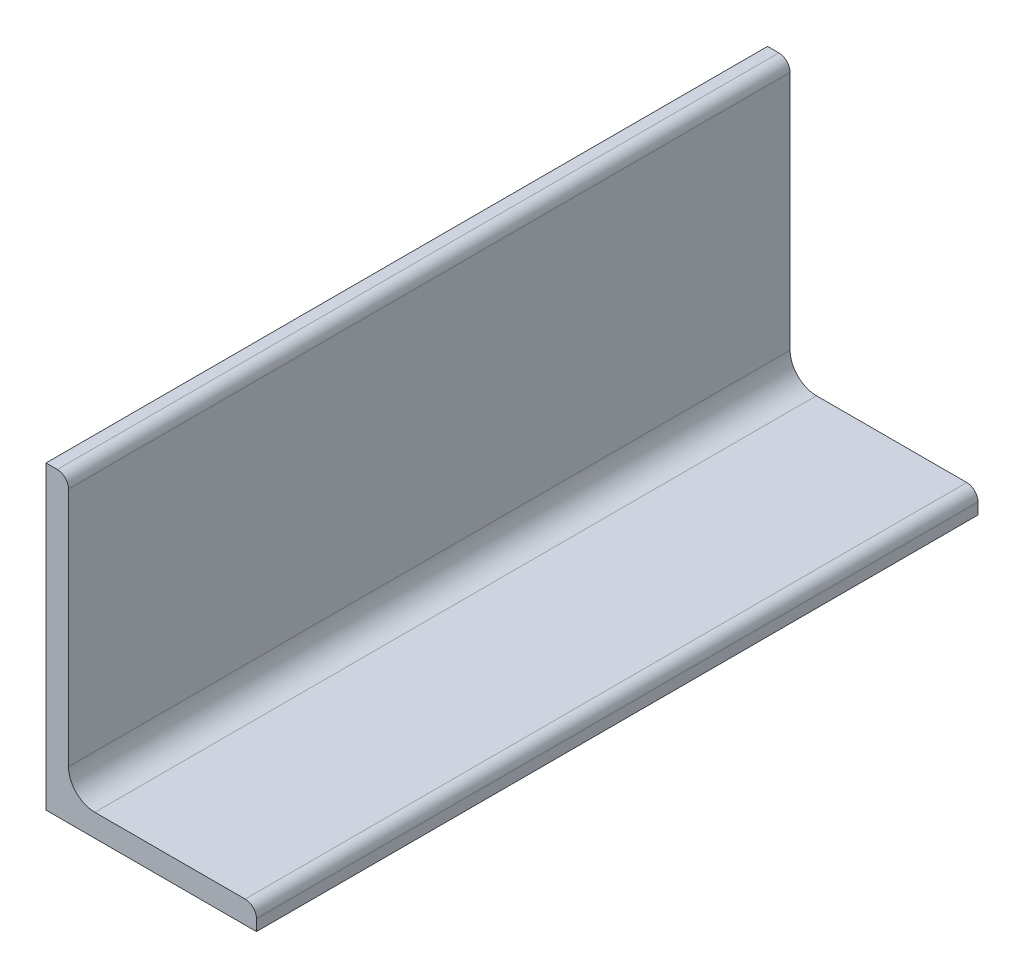
ISO-10303-21;
HEADER;
FILE_DESCRIPTION(('STEP AP214'),'2;1');
FILE_NAME('part.step','',(''),(''),'','','');
FILE_SCHEMA(('AUTOMOTIVE_DESIGN { 1 0 10303 214 1 1 1 1 }'));
ENDSEC;
DATA;
#1=APPLICATION_CONTEXT('core data for automotive mechanical design processes');
#2=APPLICATION_PROTOCOL_DEFINITION('international standard','automotive_design',2000,#1);
#3=PRODUCT_CONTEXT('',#1,'mechanical');
#4=PRODUCT('Part','Part','',(#3));
#5=PRODUCT_RELATED_PRODUCT_CATEGORY('part','',(#4));
#6=PRODUCT_DEFINITION_FORMATION('','',#4);
#7=PRODUCT_DEFINITION_CONTEXT('part definition',#1,'design');
#8=PRODUCT_DEFINITION('design','',#6,#7);
#9=PRODUCT_DEFINITION_SHAPE('','',#8);
#10=(LENGTH_UNIT() NAMED_UNIT(*) SI_UNIT(.MILLI.,.METRE.));
#11=(NAMED_UNIT(*) PLANE_ANGLE_UNIT() SI_UNIT($,.RADIAN.));
#12=(NAMED_UNIT(*) SI_UNIT($,.STERADIAN.) SOLID_ANGLE_UNIT());
#13=UNCERTAINTY_MEASURE_WITH_UNIT(LENGTH_MEASURE(1.E-05),#10,'distance_accuracy_value','');
#14=(GEOMETRIC_REPRESENTATION_CONTEXT(3) GLOBAL_UNCERTAINTY_ASSIGNED_CONTEXT((#13)) GLOBAL_UNIT_ASSIGNED_CONTEXT((#10,
#11,#12)) REPRESENTATION_CONTEXT('',''));
#15=CARTESIAN_POINT('',(0.,0.,0.));
#16=DIRECTION('',(0.,0.,1.));
#17=DIRECTION('',(1.,0.,0.));
#18=AXIS2_PLACEMENT_3D('',#15,#16,#17);
#19=CARTESIAN_POINT('',(0.0836264027816469,127.041655270204,304.8));
#20=DIRECTION('',(1.,0.,0.));
#21=DIRECTION('',(0.,0.,-1.));
#22=AXIS2_PLACEMENT_3D('',#19,#20,#21);
#23=PLANE('',#22);
#24=DIRECTION('',(0.,-1.,0.));
#25=VECTOR('',#24,1.);
#26=CARTESIAN_POINT('',(0.0836264027816469,127.041655270204,0.));
#27=LINE('',#26,#25);
#28=CARTESIAN_POINT('',(0.0836264027816469,127.041655270204,0.));
#29=VERTEX_POINT('',#28);
#30=CARTESIAN_POINT('',(0.0836264027816469,0.0416552702040917,0.));
#31=VERTEX_POINT('',#30);
#32=EDGE_CURVE('E135',#29,#31,#27,.T.);
#33=ORIENTED_EDGE('',*,*,#32,.T.);
#34=DIRECTION('',(0.,0.,-1.));
#35=VECTOR('',#34,1.);
#36=CARTESIAN_POINT('',(0.0836264027816469,0.0416552702040917,304.8));
#37=LINE('',#36,#35);
#38=CARTESIAN_POINT('',(0.0836264027816469,0.0416552702040917,304.8));
#39=VERTEX_POINT('',#38);
#40=EDGE_CURVE('E11',#39,#31,#37,.T.);
#41=ORIENTED_EDGE('',*,*,#40,.F.);
#42=DIRECTION('',(0.,-1.,0.));
#43=VECTOR('',#42,1.);
#44=CARTESIAN_POINT('',(0.0836264027816469,127.041655270204,304.8));
#45=LINE('',#44,#43);
#46=CARTESIAN_POINT('',(0.0836264027816469,127.041655270204,304.8));
#47=VERTEX_POINT('',#46);
#48=EDGE_CURVE('E151',#47,#39,#45,.T.);
#49=ORIENTED_EDGE('',*,*,#48,.F.);
#50=DIRECTION('',(0.,0.,-1.));
#51=VECTOR('',#50,1.);
#52=CARTESIAN_POINT('',(0.0836264027816469,127.041655270204,304.8));
#53=LINE('',#52,#51);
#54=EDGE_CURVE('E131',#47,#29,#53,.T.);
#55=ORIENTED_EDGE('',*,*,#54,.T.);
#56=EDGE_LOOP('',(#33,#41,#49,#55));
#57=FACE_BOUND('',#56,.T.);
#58=ADVANCED_FACE('F33',(#57),#23,.F.);
#59=CARTESIAN_POINT('',(0.0836264027816469,0.0416552702040917,304.8));
#60=DIRECTION('',(0.,1.,0.));
#61=DIRECTION('',(0.,0.,1.));
#62=AXIS2_PLACEMENT_3D('',#59,#60,#61);
#63=PLANE('',#62);
#64=DIRECTION('',(1.,0.,0.));
#65=VECTOR('',#64,1.);
#66=CARTESIAN_POINT('',(0.0836264027816469,0.0416552702040917,0.));
#67=LINE('',#66,#65);
#68=CARTESIAN_POINT('',(88.9836264027817,0.0416552702040917,0.));
#69=VERTEX_POINT('',#68);
#70=EDGE_CURVE('E138',#31,#69,#67,.T.);
#71=ORIENTED_EDGE('',*,*,#70,.T.);
#72=DIRECTION('',(0.,0.,-1.));
#73=VECTOR('',#72,1.);
#74=CARTESIAN_POINT('',(88.9836264027817,0.0416552702040917,304.8));
#75=LINE('',#74,#73);
#76=CARTESIAN_POINT('',(88.9836264027817,0.0416552702040917,304.8));
#77=VERTEX_POINT('',#76);
#78=EDGE_CURVE('E41',#77,#69,#75,.T.);
#79=ORIENTED_EDGE('',*,*,#78,.F.);
#80=DIRECTION('',(1.,0.,0.));
#81=VECTOR('',#80,1.);
#82=CARTESIAN_POINT('',(0.0836264027816469,0.0416552702040917,304.8));
#83=LINE('',#82,#81);
#84=EDGE_CURVE('E95',#39,#77,#83,.T.);
#85=ORIENTED_EDGE('',*,*,#84,.F.);
#86=ORIENTED_EDGE('',*,*,#40,.T.);
#87=EDGE_LOOP('',(#71,#79,#85,#86));
#88=FACE_BOUND('',#87,.T.);
#89=ADVANCED_FACE('F194',(#88),#63,.F.);
#90=CARTESIAN_POINT('',(88.9836264027817,0.0416552702040917,304.8));
#91=DIRECTION('',(-1.,0.,0.));
#92=DIRECTION('',(0.,0.,1.));
#93=AXIS2_PLACEMENT_3D('',#90,#91,#92);
#94=PLANE('',#93);
#95=DIRECTION('',(0.,1.,0.));
#96=VECTOR('',#95,1.);
#97=CARTESIAN_POINT('',(88.9836264027817,0.0416552702040917,0.));
#98=LINE('',#97,#96);
#99=CARTESIAN_POINT('',(88.9836264027817,4.80415527020409,0.));
#100=VERTEX_POINT('',#99);
#101=EDGE_CURVE('E140',#69,#100,#98,.T.);
#102=ORIENTED_EDGE('',*,*,#101,.T.);
#103=DIRECTION('',(0.,0.,-1.));
#104=VECTOR('',#103,1.);
#105=CARTESIAN_POINT('',(88.9836264027817,4.80415527020409,304.8));
#106=LINE('',#105,#104);
#107=CARTESIAN_POINT('',(88.9836264027817,4.80415527020409,304.8));
#108=VERTEX_POINT('',#107);
#109=EDGE_CURVE('E161',#108,#100,#106,.T.);
#110=ORIENTED_EDGE('',*,*,#109,.F.);
#111=DIRECTION('',(0.,1.,0.));
#112=VECTOR('',#111,1.);
#113=CARTESIAN_POINT('',(88.9836264027817,0.0416552702040917,304.8));
#114=LINE('',#113,#112);
#115=EDGE_CURVE('E169',#77,#108,#114,.T.);
#116=ORIENTED_EDGE('',*,*,#115,.F.);
#117=ORIENTED_EDGE('',*,*,#78,.T.);
#118=EDGE_LOOP('',(#102,#110,#116,#117));
#119=FACE_BOUND('',#118,.T.);
#120=ADVANCED_FACE('F167',(#119),#94,.F.);
#121=CARTESIAN_POINT('',(84.2211264027816,4.80415527020409,304.8));
#122=DIRECTION('',(0.,0.,-1.));
#123=DIRECTION('',(-1.,0.,0.));
#124=AXIS2_PLACEMENT_3D('',#121,#122,#123);
#125=CYLINDRICAL_SURFACE('',#124,4.7625);
#126=CARTESIAN_POINT('',(84.2211264027816,4.80415527020409,0.));
#127=DIRECTION('',(0.,0.,1.));
#128=DIRECTION('',(1.,0.,0.));
#129=AXIS2_PLACEMENT_3D('',#126,#127,#128);
#130=CIRCLE('',#129,4.7625);
#131=CARTESIAN_POINT('',(84.2211264027816,9.56665527020409,0.));
#132=VERTEX_POINT('',#131);
#133=EDGE_CURVE('E142',#100,#132,#130,.T.);
#134=ORIENTED_EDGE('',*,*,#133,.T.);
#135=DIRECTION('',(0.,0.,-1.));
#136=VECTOR('',#135,1.);
#137=CARTESIAN_POINT('',(84.2211264027816,9.56665527020409,304.8));
#138=LINE('',#137,#136);
#139=CARTESIAN_POINT('',(84.2211264027816,9.56665527020409,304.8));
#140=VERTEX_POINT('',#139);
#141=EDGE_CURVE('E158',#140,#132,#138,.T.);
#142=ORIENTED_EDGE('',*,*,#141,.F.);
#143=CARTESIAN_POINT('',(84.2211264027816,4.80415527020409,304.8));
#144=DIRECTION('',(0.,0.,1.));
#145=DIRECTION('',(1.,0.,0.));
#146=AXIS2_PLACEMENT_3D('',#143,#144,#145);
#147=CIRCLE('',#146,4.7625);
#148=EDGE_CURVE('E185',#108,#140,#147,.T.);
#149=ORIENTED_EDGE('',*,*,#148,.F.);
#150=ORIENTED_EDGE('',*,*,#109,.T.);
#151=EDGE_LOOP('',(#134,#142,#149,#150));
#152=FACE_BOUND('',#151,.T.);
#153=ADVANCED_FACE('F178',(#152),#125,.T.);
#154=CARTESIAN_POINT('',(84.2211264027816,9.56665527020409,304.8));
#155=DIRECTION('',(0.,-1.,0.));
#156=DIRECTION('',(0.,0.,-1.));
#157=AXIS2_PLACEMENT_3D('',#154,#155,#156);
#158=PLANE('',#157);
#159=DIRECTION('',(-1.,0.,0.));
#160=VECTOR('',#159,1.);
#161=CARTESIAN_POINT('',(84.2211264027816,9.56665527020409,0.));
#162=LINE('',#161,#160);
#163=CARTESIAN_POINT('',(20.7211264027816,9.56665527020409,0.));
#164=VERTEX_POINT('',#163);
#165=EDGE_CURVE('E144',#132,#164,#162,.T.);
#166=ORIENTED_EDGE('',*,*,#165,.T.);
#167=DIRECTION('',(0.,0.,-1.));
#168=VECTOR('',#167,1.);
#169=CARTESIAN_POINT('',(20.7211264027816,9.56665527020409,304.8));
#170=LINE('',#169,#168);
#171=CARTESIAN_POINT('',(20.7211264027816,9.56665527020409,304.8));
#172=VERTEX_POINT('',#171);
#173=EDGE_CURVE('E155',#172,#164,#170,.T.);
#174=ORIENTED_EDGE('',*,*,#173,.F.);
#175=DIRECTION('',(-1.,0.,0.));
#176=VECTOR('',#175,1.);
#177=CARTESIAN_POINT('',(84.2211264027816,9.56665527020409,304.8));
#178=LINE('',#177,#176);
#179=EDGE_CURVE('E184',#140,#172,#178,.T.);
#180=ORIENTED_EDGE('',*,*,#179,.F.);
#181=ORIENTED_EDGE('',*,*,#141,.T.);
#182=EDGE_LOOP('',(#166,#174,#180,#181));
#183=FACE_BOUND('',#182,.T.);
#184=ADVANCED_FACE('F182',(#183),#158,.F.);
#185=CARTESIAN_POINT('',(20.7211264027816,20.6791552702041,304.8));
#186=DIRECTION('',(0.,0.,-1.));
#187=DIRECTION('',(-1.,0.,0.));
#188=AXIS2_PLACEMENT_3D('',#185,#186,#187);
#189=CYLINDRICAL_SURFACE('',#188,11.1125);
#190=CARTESIAN_POINT('',(20.7211264027816,20.6791552702041,0.));
#191=DIRECTION('',(0.,0.,-1.));
#192=DIRECTION('',(1.,0.,0.));
#193=AXIS2_PLACEMENT_3D('',#190,#191,#192);
#194=CIRCLE('',#193,11.1125);
#195=CARTESIAN_POINT('',(9.60862640278165,20.6791552702041,0.));
#196=VERTEX_POINT('',#195);
#197=EDGE_CURVE('E146',#164,#196,#194,.T.);
#198=ORIENTED_EDGE('',*,*,#197,.T.);
#199=DIRECTION('',(0.,0.,-1.));
#200=VECTOR('',#199,1.);
#201=CARTESIAN_POINT('',(9.60862640278165,20.6791552702041,304.8));
#202=LINE('',#201,#200);
#203=CARTESIAN_POINT('',(9.60862640278165,20.6791552702041,304.8));
#204=VERTEX_POINT('',#203);
#205=EDGE_CURVE('E126',#204,#196,#202,.T.);
#206=ORIENTED_EDGE('',*,*,#205,.F.);
#207=CARTESIAN_POINT('',(20.7211264027816,20.6791552702041,304.8));
#208=DIRECTION('',(0.,0.,-1.));
#209=DIRECTION('',(1.,0.,0.));
#210=AXIS2_PLACEMENT_3D('',#207,#208,#209);
#211=CIRCLE('',#210,11.1125);
#212=EDGE_CURVE('E117',#172,#204,#211,.T.);
#213=ORIENTED_EDGE('',*,*,#212,.F.);
#214=ORIENTED_EDGE('',*,*,#173,.T.);
#215=EDGE_LOOP('',(#198,#206,#213,#214));
#216=FACE_BOUND('',#215,.T.);
#217=ADVANCED_FACE('F206',(#216),#189,.F.);
#218=CARTESIAN_POINT('',(9.60862640278165,20.6791552702041,304.8));
#219=DIRECTION('',(-1.,0.,0.));
#220=DIRECTION('',(0.,0.,1.));
#221=AXIS2_PLACEMENT_3D('',#218,#219,#220);
#222=PLANE('',#221);
#223=DIRECTION('',(0.,1.,0.));
#224=VECTOR('',#223,1.);
#225=CARTESIAN_POINT('',(9.60862640278165,20.6791552702041,0.));
#226=LINE('',#225,#224);
#227=CARTESIAN_POINT('',(9.60862640278165,122.279155270204,0.));
#228=VERTEX_POINT('',#227);
#229=EDGE_CURVE('E125',#196,#228,#226,.T.);
#230=ORIENTED_EDGE('',*,*,#229,.T.);
#231=DIRECTION('',(0.,0.,-1.));
#232=VECTOR('',#231,1.);
#233=CARTESIAN_POINT('',(9.60862640278165,122.279155270204,304.8));
#234=LINE('',#233,#232);
#235=CARTESIAN_POINT('',(9.60862640278165,122.279155270204,304.8));
#236=VERTEX_POINT('',#235);
#237=EDGE_CURVE('E122',#236,#228,#234,.T.);
#238=ORIENTED_EDGE('',*,*,#237,.F.);
#239=DIRECTION('',(0.,1.,0.));
#240=VECTOR('',#239,1.);
#241=CARTESIAN_POINT('',(9.60862640278165,20.6791552702041,304.8));
#242=LINE('',#241,#240);
#243=EDGE_CURVE('E111',#204,#236,#242,.T.);
#244=ORIENTED_EDGE('',*,*,#243,.F.);
#245=ORIENTED_EDGE('',*,*,#205,.T.);
#246=EDGE_LOOP('',(#230,#238,#244,#245));
#247=FACE_BOUND('',#246,.T.);
#248=ADVANCED_FACE('F123',(#247),#222,.F.);
#249=CARTESIAN_POINT('',(4.84612640278166,122.279155270204,304.8));
#250=DIRECTION('',(0.,0.,-1.));
#251=DIRECTION('',(-1.,0.,0.));
#252=AXIS2_PLACEMENT_3D('',#249,#250,#251);
#253=CYLINDRICAL_SURFACE('',#252,4.7625);
#254=CARTESIAN_POINT('',(4.84612640278166,122.279155270204,0.));
#255=DIRECTION('',(0.,0.,1.));
#256=DIRECTION('',(1.,0.,0.));
#257=AXIS2_PLACEMENT_3D('',#254,#255,#256);
#258=CIRCLE('',#257,4.7625);
#259=CARTESIAN_POINT('',(4.84612640278165,127.041655270204,0.));
#260=VERTEX_POINT('',#259);
#261=EDGE_CURVE('E81',#228,#260,#258,.T.);
#262=ORIENTED_EDGE('',*,*,#261,.T.);
#263=DIRECTION('',(0.,0.,-1.));
#264=VECTOR('',#263,1.);
#265=CARTESIAN_POINT('',(4.84612640278165,127.041655270204,304.8));
#266=LINE('',#265,#264);
#267=CARTESIAN_POINT('',(4.84612640278165,127.041655270204,304.8));
#268=VERTEX_POINT('',#267);
#269=EDGE_CURVE('E127',#268,#260,#266,.T.);
#270=ORIENTED_EDGE('',*,*,#269,.F.);
#271=CARTESIAN_POINT('',(4.84612640278166,122.279155270204,304.8));
#272=DIRECTION('',(0.,0.,1.));
#273=DIRECTION('',(1.,0.,0.));
#274=AXIS2_PLACEMENT_3D('',#271,#272,#273);
#275=CIRCLE('',#274,4.7625);
#276=EDGE_CURVE('E115',#236,#268,#275,.T.);
#277=ORIENTED_EDGE('',*,*,#276,.F.);
#278=ORIENTED_EDGE('',*,*,#237,.T.);
#279=EDGE_LOOP('',(#262,#270,#277,#278));
#280=FACE_BOUND('',#279,.T.);
#281=ADVANCED_FACE('F129',(#280),#253,.T.);
#282=CARTESIAN_POINT('',(4.84612640278165,127.041655270204,304.8));
#283=DIRECTION('',(0.,-1.,0.));
#284=DIRECTION('',(0.,0.,-1.));
#285=AXIS2_PLACEMENT_3D('',#282,#283,#284);
#286=PLANE('',#285);
#287=DIRECTION('',(-1.,0.,0.));
#288=VECTOR('',#287,1.);
#289=CARTESIAN_POINT('',(4.84612640278165,127.041655270204,0.));
#290=LINE('',#289,#288);
#291=EDGE_CURVE('E87',#260,#29,#290,.T.);
#292=ORIENTED_EDGE('',*,*,#291,.T.);
#293=ORIENTED_EDGE('',*,*,#54,.F.);
#294=DIRECTION('',(-1.,0.,0.));
#295=VECTOR('',#294,1.);
#296=CARTESIAN_POINT('',(4.84612640278165,127.041655270204,304.8));
#297=LINE('',#296,#295);
#298=EDGE_CURVE('E49',#268,#47,#297,.T.);
#299=ORIENTED_EDGE('',*,*,#298,.F.);
#300=ORIENTED_EDGE('',*,*,#269,.T.);
#301=EDGE_LOOP('',(#292,#293,#299,#300));
#302=FACE_BOUND('',#301,.T.);
#303=ADVANCED_FACE('F214',(#302),#286,.F.);
#304=CARTESIAN_POINT('',(84.2211264027816,4.80415527020409,304.8));
#305=DIRECTION('',(0.,0.,1.));
#306=DIRECTION('',(1.,0.,0.));
#307=AXIS2_PLACEMENT_3D('',#304,#305,#306);
#308=PLANE('',#307);
#309=ORIENTED_EDGE('',*,*,#48,.T.);
#310=ORIENTED_EDGE('',*,*,#84,.T.);
#311=ORIENTED_EDGE('',*,*,#115,.T.);
#312=ORIENTED_EDGE('',*,*,#148,.T.);
#313=ORIENTED_EDGE('',*,*,#179,.T.);
#314=ORIENTED_EDGE('',*,*,#212,.T.);
#315=ORIENTED_EDGE('',*,*,#243,.T.);
#316=ORIENTED_EDGE('',*,*,#276,.T.);
#317=ORIENTED_EDGE('',*,*,#298,.T.);
#318=EDGE_LOOP('',(#309,#310,#311,#312,#313,#314,#315,#316,#317));
#319=FACE_BOUND('',#318,.T.);
#320=ADVANCED_FACE('F113',(#319),#308,.T.);
#321=CARTESIAN_POINT('',(84.2211264027816,4.80415527020409,0.));
#322=DIRECTION('',(0.,0.,1.));
#323=DIRECTION('',(1.,0.,0.));
#324=AXIS2_PLACEMENT_3D('',#321,#322,#323);
#325=PLANE('',#324);
#326=ORIENTED_EDGE('',*,*,#32,.F.);
#327=ORIENTED_EDGE('',*,*,#291,.F.);
#328=ORIENTED_EDGE('',*,*,#261,.F.);
#329=ORIENTED_EDGE('',*,*,#229,.F.);
#330=ORIENTED_EDGE('',*,*,#197,.F.);
#331=ORIENTED_EDGE('',*,*,#165,.F.);
#332=ORIENTED_EDGE('',*,*,#133,.F.);
#333=ORIENTED_EDGE('',*,*,#101,.F.);
#334=ORIENTED_EDGE('',*,*,#70,.F.);
#335=EDGE_LOOP('',(#326,#327,#328,#329,#330,#331,#332,#333,#334));
#336=FACE_BOUND('',#335,.T.);
#337=ADVANCED_FACE('F173',(#336),#325,.F.);
#338=CLOSED_SHELL('',(#58,#89,#120,#153,#184,#217,#248,#281,#303,#320,#337));
#339=MANIFOLD_SOLID_BREP('B2',#338);
#340=ADVANCED_BREP_SHAPE_REPRESENTATION('',(#18,#339),#14);
#341=SHAPE_DEFINITION_REPRESENTATION(#9,#340);
ENDSEC;
END-ISO-10303-21;
